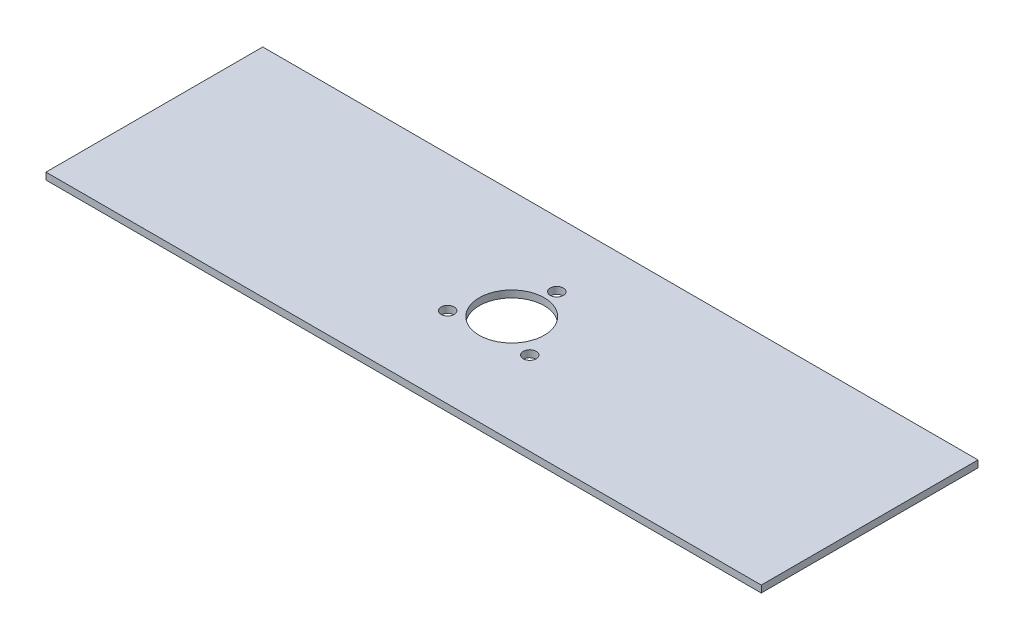
ISO-10303-21;
HEADER;
FILE_DESCRIPTION(('STEP AP214'),'2;1');
FILE_NAME('part.step','',(''),(''),'','','');
FILE_SCHEMA(('AUTOMOTIVE_DESIGN { 1 0 10303 214 1 1 1 1 }'));
ENDSEC;
DATA;
#1=APPLICATION_CONTEXT('core data for automotive mechanical design processes');
#2=APPLICATION_PROTOCOL_DEFINITION('international standard','automotive_design',2000,#1);
#3=PRODUCT_CONTEXT('',#1,'mechanical');
#4=PRODUCT('Part','Part','',(#3));
#5=PRODUCT_RELATED_PRODUCT_CATEGORY('part','',(#4));
#6=PRODUCT_DEFINITION_FORMATION('','',#4);
#7=PRODUCT_DEFINITION_CONTEXT('part definition',#1,'design');
#8=PRODUCT_DEFINITION('design','',#6,#7);
#9=PRODUCT_DEFINITION_SHAPE('','',#8);
#10=(LENGTH_UNIT() NAMED_UNIT(*) SI_UNIT(.MILLI.,.METRE.));
#11=(NAMED_UNIT(*) PLANE_ANGLE_UNIT() SI_UNIT($,.RADIAN.));
#12=(NAMED_UNIT(*) SI_UNIT($,.STERADIAN.) SOLID_ANGLE_UNIT());
#13=UNCERTAINTY_MEASURE_WITH_UNIT(LENGTH_MEASURE(1.E-05),#10,'distance_accuracy_value','');
#14=(GEOMETRIC_REPRESENTATION_CONTEXT(3) GLOBAL_UNCERTAINTY_ASSIGNED_CONTEXT((#13)) GLOBAL_UNIT_ASSIGNED_CONTEXT((#10,
#11,#12)) REPRESENTATION_CONTEXT('',''));
#15=CARTESIAN_POINT('',(0.,0.,0.));
#16=DIRECTION('',(0.,0.,1.));
#17=DIRECTION('',(1.,0.,0.));
#18=AXIS2_PLACEMENT_3D('',#15,#16,#17);
#19=CARTESIAN_POINT('',(-91.9860627177701,1.6,-41.8249128919861));
#20=DIRECTION('',(1.,0.,0.));
#21=DIRECTION('',(0.,0.,-1.));
#22=AXIS2_PLACEMENT_3D('',#19,#20,#21);
#23=PLANE('',#22);
#24=DIRECTION('',(0.,0.,1.));
#25=VECTOR('',#24,1.);
#26=CARTESIAN_POINT('',(-91.9860627177701,0.,-41.8249128919861));
#27=LINE('',#26,#25);
#28=CARTESIAN_POINT('',(-91.9860627177701,0.,-41.8249128919861));
#29=VERTEX_POINT('',#28);
#30=CARTESIAN_POINT('',(-91.9860627177701,0.,8.17508710801394));
#31=VERTEX_POINT('',#30);
#32=EDGE_CURVE('E111',#29,#31,#27,.T.);
#33=ORIENTED_EDGE('',*,*,#32,.T.);
#34=DIRECTION('',(0.,-1.,0.));
#35=VECTOR('',#34,1.);
#36=CARTESIAN_POINT('',(-91.9860627177701,1.6,8.17508710801394));
#37=LINE('',#36,#35);
#38=CARTESIAN_POINT('',(-91.9860627177701,1.6,8.17508710801394));
#39=VERTEX_POINT('',#38);
#40=EDGE_CURVE('E11',#39,#31,#37,.T.);
#41=ORIENTED_EDGE('',*,*,#40,.F.);
#42=DIRECTION('',(0.,0.,1.));
#43=VECTOR('',#42,1.);
#44=CARTESIAN_POINT('',(-91.9860627177701,1.6,-41.8249128919861));
#45=LINE('',#44,#43);
#46=CARTESIAN_POINT('',(-91.9860627177701,1.6,-41.8249128919861));
#47=VERTEX_POINT('',#46);
#48=EDGE_CURVE('E93',#47,#39,#45,.T.);
#49=ORIENTED_EDGE('',*,*,#48,.F.);
#50=DIRECTION('',(0.,-1.,0.));
#51=VECTOR('',#50,1.);
#52=CARTESIAN_POINT('',(-91.9860627177701,1.6,-41.8249128919861));
#53=LINE('',#52,#51);
#54=EDGE_CURVE('E60',#47,#29,#53,.T.);
#55=ORIENTED_EDGE('',*,*,#54,.T.);
#56=EDGE_LOOP('',(#33,#41,#49,#55));
#57=FACE_BOUND('',#56,.T.);
#58=ADVANCED_FACE('F43',(#57),#23,.F.);
#59=CARTESIAN_POINT('',(-91.9860627177701,1.6,8.17508710801394));
#60=DIRECTION('',(0.,0.,-1.));
#61=DIRECTION('',(-1.,0.,0.));
#62=AXIS2_PLACEMENT_3D('',#59,#60,#61);
#63=PLANE('',#62);
#64=DIRECTION('',(1.,0.,0.));
#65=VECTOR('',#64,1.);
#66=CARTESIAN_POINT('',(-91.9860627177701,0.,8.17508710801394));
#67=LINE('',#66,#65);
#68=CARTESIAN_POINT('',(73.0139372822299,0.,8.17508710801394));
#69=VERTEX_POINT('',#68);
#70=EDGE_CURVE('E99',#31,#69,#67,.T.);
#71=ORIENTED_EDGE('',*,*,#70,.T.);
#72=DIRECTION('',(0.,-1.,0.));
#73=VECTOR('',#72,1.);
#74=CARTESIAN_POINT('',(73.0139372822299,1.6,8.17508710801394));
#75=LINE('',#74,#73);
#76=CARTESIAN_POINT('',(73.0139372822299,1.6,8.17508710801394));
#77=VERTEX_POINT('',#76);
#78=EDGE_CURVE('E52',#77,#69,#75,.T.);
#79=ORIENTED_EDGE('',*,*,#78,.F.);
#80=DIRECTION('',(1.,0.,0.));
#81=VECTOR('',#80,1.);
#82=CARTESIAN_POINT('',(-91.9860627177701,1.6,8.17508710801394));
#83=LINE('',#82,#81);
#84=EDGE_CURVE('E85',#39,#77,#83,.T.);
#85=ORIENTED_EDGE('',*,*,#84,.F.);
#86=ORIENTED_EDGE('',*,*,#40,.T.);
#87=EDGE_LOOP('',(#71,#79,#85,#86));
#88=FACE_BOUND('',#87,.T.);
#89=ADVANCED_FACE('F98',(#88),#63,.F.);
#90=CARTESIAN_POINT('',(73.0139372822299,1.6,-41.8249128919861));
#91=DIRECTION('',(1.,0.,0.));
#92=DIRECTION('',(0.,0.,-1.));
#93=AXIS2_PLACEMENT_3D('',#90,#91,#92);
#94=PLANE('',#93);
#95=DIRECTION('',(0.,0.,1.));
#96=VECTOR('',#95,1.);
#97=CARTESIAN_POINT('',(73.0139372822299,0.,-41.8249128919861));
#98=LINE('',#97,#96);
#99=CARTESIAN_POINT('',(73.0139372822299,0.,-41.8249128919861));
#100=VERTEX_POINT('',#99);
#101=EDGE_CURVE('E117',#100,#69,#98,.T.);
#102=ORIENTED_EDGE('',*,*,#101,.F.);
#103=DIRECTION('',(0.,-1.,0.));
#104=VECTOR('',#103,1.);
#105=CARTESIAN_POINT('',(73.0139372822299,1.6,-41.8249128919861));
#106=LINE('',#105,#104);
#107=CARTESIAN_POINT('',(73.0139372822299,1.6,-41.8249128919861));
#108=VERTEX_POINT('',#107);
#109=EDGE_CURVE('E74',#108,#100,#106,.T.);
#110=ORIENTED_EDGE('',*,*,#109,.F.);
#111=DIRECTION('',(0.,0.,1.));
#112=VECTOR('',#111,1.);
#113=CARTESIAN_POINT('',(73.0139372822299,1.6,-41.8249128919861));
#114=LINE('',#113,#112);
#115=EDGE_CURVE('E92',#108,#77,#114,.T.);
#116=ORIENTED_EDGE('',*,*,#115,.T.);
#117=ORIENTED_EDGE('',*,*,#78,.T.);
#118=EDGE_LOOP('',(#102,#110,#116,#117));
#119=FACE_BOUND('',#118,.T.);
#120=ADVANCED_FACE('F103',(#119),#94,.T.);
#121=CARTESIAN_POINT('',(-91.9860627177701,1.6,-41.8249128919861));
#122=DIRECTION('',(0.,0.,-1.));
#123=DIRECTION('',(-1.,0.,0.));
#124=AXIS2_PLACEMENT_3D('',#121,#122,#123);
#125=PLANE('',#124);
#126=DIRECTION('',(1.,0.,0.));
#127=VECTOR('',#126,1.);
#128=CARTESIAN_POINT('',(-91.9860627177701,0.,-41.8249128919861));
#129=LINE('',#128,#127);
#130=EDGE_CURVE('E120',#29,#100,#129,.T.);
#131=ORIENTED_EDGE('',*,*,#130,.F.);
#132=ORIENTED_EDGE('',*,*,#54,.F.);
#133=DIRECTION('',(1.,0.,0.));
#134=VECTOR('',#133,1.);
#135=CARTESIAN_POINT('',(-91.9860627177701,1.6,-41.8249128919861));
#136=LINE('',#135,#134);
#137=EDGE_CURVE('E105',#47,#108,#136,.T.);
#138=ORIENTED_EDGE('',*,*,#137,.T.);
#139=ORIENTED_EDGE('',*,*,#109,.T.);
#140=EDGE_LOOP('',(#131,#132,#138,#139));
#141=FACE_BOUND('',#140,.T.);
#142=ADVANCED_FACE('F167',(#141),#125,.T.);
#143=CARTESIAN_POINT('',(0.,1.6,0.));
#144=DIRECTION('',(0.,1.,0.));
#145=DIRECTION('',(0.,0.,1.));
#146=AXIS2_PLACEMENT_3D('',#143,#144,#145);
#147=PLANE('',#146);
#148=CARTESIAN_POINT('',(-17.9731551725899,1.6,-10.4618574715624));
#149=DIRECTION('',(0.,1.,0.));
#150=DIRECTION('',(0.,0.,1.));
#151=AXIS2_PLACEMENT_3D('',#148,#149,#150);
#152=CIRCLE('',#151,1.49999999999999);
#153=CARTESIAN_POINT('',(-17.9731551725899,1.6,-8.96185747156246));
#154=VERTEX_POINT('',#153);
#155=EDGE_CURVE('E157',#154,#154,#152,.T.);
#156=ORIENTED_EDGE('',*,*,#155,.F.);
#157=EDGE_LOOP('',(#156));
#158=FACE_BOUND('',#157,.T.);
#159=CARTESIAN_POINT('',(0.359615971395499,1.6,-11.0729498430286));
#160=DIRECTION('',(0.,1.,0.));
#161=DIRECTION('',(0.,0.,1.));
#162=AXIS2_PLACEMENT_3D('',#159,#160,#161);
#163=CIRCLE('',#162,1.49999999999999);
#164=CARTESIAN_POINT('',(0.359615971395499,1.6,-9.57294984302863));
#165=VERTEX_POINT('',#164);
#166=EDGE_CURVE('E149',#165,#165,#163,.T.);
#167=ORIENTED_EDGE('',*,*,#166,.F.);
#168=EDGE_LOOP('',(#167));
#169=FACE_BOUND('',#168,.T.);
#170=CARTESIAN_POINT('',(-9.1734250234769,1.6,-26.8391330268561));
#171=DIRECTION('',(0.,1.,0.));
#172=DIRECTION('',(0.,0.,1.));
#173=AXIS2_PLACEMENT_3D('',#170,#171,#172);
#174=CIRCLE('',#173,1.5);
#175=CARTESIAN_POINT('',(-9.1734250234769,1.6,-25.3391330268561));
#176=VERTEX_POINT('',#175);
#177=EDGE_CURVE('E141',#176,#176,#174,.T.);
#178=ORIENTED_EDGE('',*,*,#177,.F.);
#179=EDGE_LOOP('',(#178));
#180=FACE_BOUND('',#179,.T.);
#181=CARTESIAN_POINT('',(-9.41786197206337,1.6,-16.6949996605175));
#182=DIRECTION('',(0.,1.,0.));
#183=DIRECTION('',(0.,0.,1.));
#184=AXIS2_PLACEMENT_3D('',#181,#182,#183);
#185=CIRCLE('',#184,7.49999999999999);
#186=CARTESIAN_POINT('',(-9.41786197206337,1.6,-9.19499966051749));
#187=VERTEX_POINT('',#186);
#188=EDGE_CURVE('E133',#187,#187,#185,.T.);
#189=ORIENTED_EDGE('',*,*,#188,.F.);
#190=EDGE_LOOP('',(#189));
#191=FACE_BOUND('',#190,.T.);
#192=ORIENTED_EDGE('',*,*,#48,.T.);
#193=ORIENTED_EDGE('',*,*,#84,.T.);
#194=ORIENTED_EDGE('',*,*,#115,.F.);
#195=ORIENTED_EDGE('',*,*,#137,.F.);
#196=EDGE_LOOP('',(#192,#193,#194,#195));
#197=FACE_BOUND('',#196,.T.);
#198=ADVANCED_FACE('F89',(#158,#169,#180,#191,#197),#147,.T.);
#199=CARTESIAN_POINT('',(0.,0.,0.));
#200=DIRECTION('',(0.,1.,0.));
#201=DIRECTION('',(0.,0.,1.));
#202=AXIS2_PLACEMENT_3D('',#199,#200,#201);
#203=PLANE('',#202);
#204=CARTESIAN_POINT('',(-17.9731551725899,0.,-10.4618574715624));
#205=DIRECTION('',(0.,1.,0.));
#206=DIRECTION('',(0.,0.,1.));
#207=AXIS2_PLACEMENT_3D('',#204,#205,#206);
#208=CIRCLE('',#207,1.49999999999999);
#209=CARTESIAN_POINT('',(-17.9731551725899,0.,-8.96185747156245));
#210=VERTEX_POINT('',#209);
#211=EDGE_CURVE('E153',#210,#210,#208,.T.);
#212=ORIENTED_EDGE('',*,*,#211,.T.);
#213=EDGE_LOOP('',(#212));
#214=FACE_BOUND('',#213,.T.);
#215=CARTESIAN_POINT('',(0.359615971395499,0.,-11.0729498430286));
#216=DIRECTION('',(0.,1.,0.));
#217=DIRECTION('',(0.,0.,1.));
#218=AXIS2_PLACEMENT_3D('',#215,#216,#217);
#219=CIRCLE('',#218,1.5);
#220=CARTESIAN_POINT('',(0.359615971395499,0.,-9.57294984302863));
#221=VERTEX_POINT('',#220);
#222=EDGE_CURVE('E145',#221,#221,#219,.T.);
#223=ORIENTED_EDGE('',*,*,#222,.T.);
#224=EDGE_LOOP('',(#223));
#225=FACE_BOUND('',#224,.T.);
#226=CARTESIAN_POINT('',(-9.1734250234769,0.,-26.8391330268561));
#227=DIRECTION('',(0.,1.,0.));
#228=DIRECTION('',(0.,0.,1.));
#229=AXIS2_PLACEMENT_3D('',#226,#227,#228);
#230=CIRCLE('',#229,1.5);
#231=CARTESIAN_POINT('',(-9.1734250234769,0.,-25.3391330268561));
#232=VERTEX_POINT('',#231);
#233=EDGE_CURVE('E137',#232,#232,#230,.T.);
#234=ORIENTED_EDGE('',*,*,#233,.T.);
#235=EDGE_LOOP('',(#234));
#236=FACE_BOUND('',#235,.T.);
#237=CARTESIAN_POINT('',(-9.41786197206337,0.,-16.6949996605175));
#238=DIRECTION('',(0.,1.,0.));
#239=DIRECTION('',(0.,0.,1.));
#240=AXIS2_PLACEMENT_3D('',#237,#238,#239);
#241=CIRCLE('',#240,7.5);
#242=CARTESIAN_POINT('',(-9.41786197206337,0.,-9.19499966051748));
#243=VERTEX_POINT('',#242);
#244=EDGE_CURVE('E114',#243,#243,#241,.T.);
#245=ORIENTED_EDGE('',*,*,#244,.T.);
#246=EDGE_LOOP('',(#245));
#247=FACE_BOUND('',#246,.T.);
#248=ORIENTED_EDGE('',*,*,#32,.F.);
#249=ORIENTED_EDGE('',*,*,#130,.T.);
#250=ORIENTED_EDGE('',*,*,#101,.T.);
#251=ORIENTED_EDGE('',*,*,#70,.F.);
#252=EDGE_LOOP('',(#248,#249,#250,#251));
#253=FACE_BOUND('',#252,.T.);
#254=ADVANCED_FACE('F166',(#214,#225,#236,#247,#253),#203,.F.);
#255=CARTESIAN_POINT('',(-9.41786197206337,1.6,-16.6949996605175));
#256=DIRECTION('',(0.,1.,0.));
#257=DIRECTION('',(0.,0.,1.));
#258=AXIS2_PLACEMENT_3D('',#255,#256,#257);
#259=CYLINDRICAL_SURFACE('',#258,7.49999999999999);
#260=ORIENTED_EDGE('',*,*,#244,.F.);
#261=EDGE_LOOP('',(#260));
#262=FACE_BOUND('',#261,.T.);
#263=ORIENTED_EDGE('',*,*,#188,.T.);
#264=EDGE_LOOP('',(#263));
#265=FACE_BOUND('',#264,.T.);
#266=ADVANCED_FACE('F175',(#262,#265),#259,.F.);
#267=CARTESIAN_POINT('',(-9.1734250234769,1.6,-26.8391330268561));
#268=DIRECTION('',(0.,1.,0.));
#269=DIRECTION('',(0.,0.,1.));
#270=AXIS2_PLACEMENT_3D('',#267,#268,#269);
#271=CYLINDRICAL_SURFACE('',#270,1.5);
#272=ORIENTED_EDGE('',*,*,#233,.F.);
#273=EDGE_LOOP('',(#272));
#274=FACE_BOUND('',#273,.T.);
#275=ORIENTED_EDGE('',*,*,#177,.T.);
#276=EDGE_LOOP('',(#275));
#277=FACE_BOUND('',#276,.T.);
#278=ADVANCED_FACE('F177',(#274,#277),#271,.F.);
#279=CARTESIAN_POINT('',(0.359615971395499,1.6,-11.0729498430286));
#280=DIRECTION('',(0.,1.,0.));
#281=DIRECTION('',(0.,0.,1.));
#282=AXIS2_PLACEMENT_3D('',#279,#280,#281);
#283=CYLINDRICAL_SURFACE('',#282,1.49999999999999);
#284=ORIENTED_EDGE('',*,*,#222,.F.);
#285=EDGE_LOOP('',(#284));
#286=FACE_BOUND('',#285,.T.);
#287=ORIENTED_EDGE('',*,*,#166,.T.);
#288=EDGE_LOOP('',(#287));
#289=FACE_BOUND('',#288,.T.);
#290=ADVANCED_FACE('F184',(#286,#289),#283,.F.);
#291=CARTESIAN_POINT('',(-17.9731551725899,1.6,-10.4618574715624));
#292=DIRECTION('',(0.,1.,0.));
#293=DIRECTION('',(0.,0.,1.));
#294=AXIS2_PLACEMENT_3D('',#291,#292,#293);
#295=CYLINDRICAL_SURFACE('',#294,1.49999999999999);
#296=ORIENTED_EDGE('',*,*,#211,.F.);
#297=EDGE_LOOP('',(#296));
#298=FACE_BOUND('',#297,.T.);
#299=ORIENTED_EDGE('',*,*,#155,.T.);
#300=EDGE_LOOP('',(#299));
#301=FACE_BOUND('',#300,.T.);
#302=ADVANCED_FACE('F162',(#298,#301),#295,.F.);
#303=CLOSED_SHELL('',(#58,#89,#120,#142,#198,#254,#266,#278,#290,#302));
#304=MANIFOLD_SOLID_BREP('B2',#303);
#305=ADVANCED_BREP_SHAPE_REPRESENTATION('',(#18,#304),#14);
#306=SHAPE_DEFINITION_REPRESENTATION(#9,#305);
ENDSEC;
END-ISO-10303-21;
